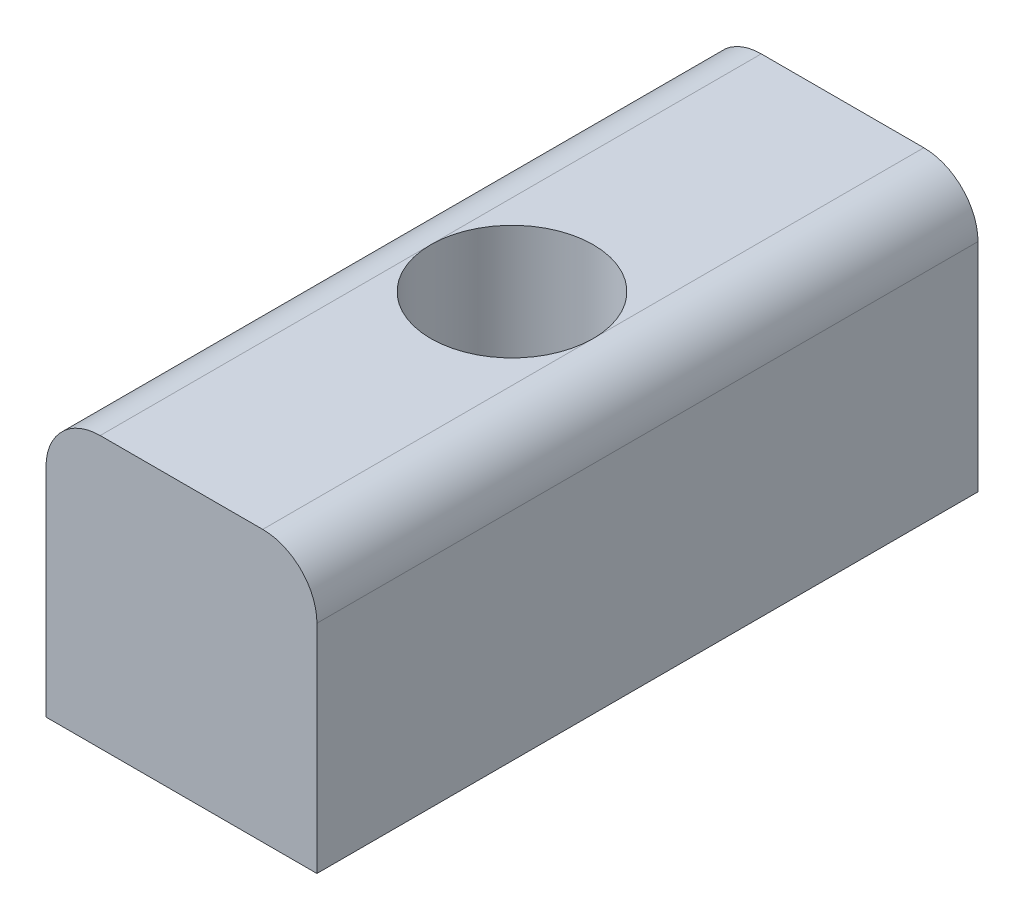
ISO-10303-21;
HEADER;
FILE_DESCRIPTION(('STEP AP214'),'2;1');
FILE_NAME('part.step','',(''),(''),'','','');
FILE_SCHEMA(('AUTOMOTIVE_DESIGN { 1 0 10303 214 1 1 1 1 }'));
ENDSEC;
DATA;
#1=APPLICATION_CONTEXT('core data for automotive mechanical design processes');
#2=APPLICATION_PROTOCOL_DEFINITION('international standard','automotive_design',2000,#1);
#3=PRODUCT_CONTEXT('',#1,'mechanical');
#4=PRODUCT('Part','Part','',(#3));
#5=PRODUCT_RELATED_PRODUCT_CATEGORY('part','',(#4));
#6=PRODUCT_DEFINITION_FORMATION('','',#4);
#7=PRODUCT_DEFINITION_CONTEXT('part definition',#1,'design');
#8=PRODUCT_DEFINITION('design','',#6,#7);
#9=PRODUCT_DEFINITION_SHAPE('','',#8);
#10=(LENGTH_UNIT() NAMED_UNIT(*) SI_UNIT(.MILLI.,.METRE.));
#11=(NAMED_UNIT(*) PLANE_ANGLE_UNIT() SI_UNIT($,.RADIAN.));
#12=(NAMED_UNIT(*) SI_UNIT($,.STERADIAN.) SOLID_ANGLE_UNIT());
#13=UNCERTAINTY_MEASURE_WITH_UNIT(LENGTH_MEASURE(1.E-05),#10,'distance_accuracy_value','');
#14=(GEOMETRIC_REPRESENTATION_CONTEXT(3) GLOBAL_UNCERTAINTY_ASSIGNED_CONTEXT((#13)) GLOBAL_UNIT_ASSIGNED_CONTEXT((#10,
#11,#12)) REPRESENTATION_CONTEXT('',''));
#15=CARTESIAN_POINT('',(0.,0.,0.));
#16=DIRECTION('',(0.,0.,1.));
#17=DIRECTION('',(1.,0.,0.));
#18=AXIS2_PLACEMENT_3D('',#15,#16,#17);
#19=CARTESIAN_POINT('',(0.,10.,0.));
#20=DIRECTION('',(0.,-1.,0.));
#21=DIRECTION('',(0.,0.,-1.));
#22=AXIS2_PLACEMENT_3D('',#19,#20,#21);
#23=PLANE('',#22);
#24=DIRECTION('',(1.,0.,0.));
#25=VECTOR('',#24,1.);
#26=CARTESIAN_POINT('',(-4.99999999999999,10.,12.2));
#27=LINE('',#26,#25);
#28=CARTESIAN_POINT('',(-2.99999999999999,10.,12.2));
#29=VERTEX_POINT('',#28);
#30=CARTESIAN_POINT('',(3.00000000000001,10.,12.2));
#31=VERTEX_POINT('',#30);
#32=EDGE_CURVE('E134',#29,#31,#27,.T.);
#33=ORIENTED_EDGE('',*,*,#32,.T.);
#34=DIRECTION('',(0.,0.,-1.));
#35=VECTOR('',#34,1.);
#36=CARTESIAN_POINT('',(3.00000000000001,10.,0.));
#37=LINE('',#36,#35);
#38=CARTESIAN_POINT('',(3.00000000000001,10.,0.));
#39=VERTEX_POINT('',#38);
#40=EDGE_CURVE('E159',#31,#39,#37,.T.);
#41=ORIENTED_EDGE('',*,*,#40,.T.);
#42=CARTESIAN_POINT('',(0.,10.,0.));
#43=DIRECTION('',(0.,1.,0.));
#44=DIRECTION('',(0.,0.,1.));
#45=AXIS2_PLACEMENT_3D('',#42,#43,#44);
#46=CIRCLE('',#45,3.);
#47=CARTESIAN_POINT('',(-2.99999999999999,10.,0.));
#48=VERTEX_POINT('',#47);
#49=EDGE_CURVE('E131',#48,#39,#46,.T.);
#50=ORIENTED_EDGE('',*,*,#49,.F.);
#51=DIRECTION('',(0.,0.,1.));
#52=VECTOR('',#51,1.);
#53=CARTESIAN_POINT('',(-2.99999999999999,10.,0.));
#54=LINE('',#53,#52);
#55=EDGE_CURVE('E110',#48,#29,#54,.T.);
#56=ORIENTED_EDGE('',*,*,#55,.T.);
#57=EDGE_LOOP('',(#33,#41,#50,#56));
#58=FACE_BOUND('',#57,.T.);
#59=ADVANCED_FACE('F39',(#58),#23,.F.);
#60=EDGE_CURVE('E127',#39,#48,#46,.T.);
#61=ORIENTED_EDGE('',*,*,#60,.F.);
#62=DIRECTION('',(0.,0.,-1.));
#63=VECTOR('',#62,1.);
#64=CARTESIAN_POINT('',(3.00000000000001,10.,0.));
#65=LINE('',#64,#63);
#66=CARTESIAN_POINT('',(3.00000000000001,10.,-12.2));
#67=VERTEX_POINT('',#66);
#68=EDGE_CURVE('E156',#39,#67,#65,.T.);
#69=ORIENTED_EDGE('',*,*,#68,.T.);
#70=DIRECTION('',(-1.,0.,0.));
#71=VECTOR('',#70,1.);
#72=CARTESIAN_POINT('',(-4.99999999999999,10.,-12.2));
#73=LINE('',#72,#71);
#74=CARTESIAN_POINT('',(-2.99999999999999,10.,-12.2));
#75=VERTEX_POINT('',#74);
#76=EDGE_CURVE('E142',#67,#75,#73,.T.);
#77=ORIENTED_EDGE('',*,*,#76,.T.);
#78=DIRECTION('',(0.,0.,1.));
#79=VECTOR('',#78,1.);
#80=CARTESIAN_POINT('',(-2.99999999999999,10.,0.));
#81=LINE('',#80,#79);
#82=EDGE_CURVE('E152',#75,#48,#81,.T.);
#83=ORIENTED_EDGE('',*,*,#82,.T.);
#84=EDGE_LOOP('',(#61,#69,#77,#83));
#85=FACE_BOUND('',#84,.T.);
#86=ADVANCED_FACE('F185',(#85),#23,.F.);
#87=CARTESIAN_POINT('',(0.,0.,0.));
#88=DIRECTION('',(0.,-1.,0.));
#89=DIRECTION('',(0.,0.,-1.));
#90=AXIS2_PLACEMENT_3D('',#87,#88,#89);
#91=PLANE('',#90);
#92=DIRECTION('',(0.,0.,-1.));
#93=VECTOR('',#92,1.);
#94=CARTESIAN_POINT('',(5.00000000000001,0.,12.2));
#95=LINE('',#94,#93);
#96=CARTESIAN_POINT('',(5.00000000000001,0.,12.2));
#97=VERTEX_POINT('',#96);
#98=CARTESIAN_POINT('',(5.00000000000001,0.,-12.2));
#99=VERTEX_POINT('',#98);
#100=EDGE_CURVE('E118',#97,#99,#95,.T.);
#101=ORIENTED_EDGE('',*,*,#100,.F.);
#102=DIRECTION('',(1.,0.,0.));
#103=VECTOR('',#102,1.);
#104=CARTESIAN_POINT('',(-4.99999999999999,0.,12.2));
#105=LINE('',#104,#103);
#106=CARTESIAN_POINT('',(-4.99999999999999,0.,12.2));
#107=VERTEX_POINT('',#106);
#108=EDGE_CURVE('E139',#107,#97,#105,.T.);
#109=ORIENTED_EDGE('',*,*,#108,.F.);
#110=DIRECTION('',(0.,0.,1.));
#111=VECTOR('',#110,1.);
#112=CARTESIAN_POINT('',(-4.99999999999999,0.,12.2));
#113=LINE('',#112,#111);
#114=CARTESIAN_POINT('',(-4.99999999999999,0.,-12.2));
#115=VERTEX_POINT('',#114);
#116=EDGE_CURVE('E120',#115,#107,#113,.T.);
#117=ORIENTED_EDGE('',*,*,#116,.F.);
#118=DIRECTION('',(-1.,0.,0.));
#119=VECTOR('',#118,1.);
#120=CARTESIAN_POINT('',(-4.99999999999999,0.,-12.2));
#121=LINE('',#120,#119);
#122=EDGE_CURVE('E104',#99,#115,#121,.T.);
#123=ORIENTED_EDGE('',*,*,#122,.F.);
#124=EDGE_LOOP('',(#101,#109,#117,#123));
#125=FACE_BOUND('',#124,.T.);
#126=CARTESIAN_POINT('',(0.,0.,0.));
#127=DIRECTION('',(0.,1.,0.));
#128=DIRECTION('',(0.,0.,1.));
#129=AXIS2_PLACEMENT_3D('',#126,#127,#128);
#130=CIRCLE('',#129,3.);
#131=CARTESIAN_POINT('',(0.,0.,2.99999999999997));
#132=VERTEX_POINT('',#131);
#133=EDGE_CURVE('E190',#132,#132,#130,.T.);
#134=ORIENTED_EDGE('',*,*,#133,.T.);
#135=EDGE_LOOP('',(#134));
#136=FACE_BOUND('',#135,.T.);
#137=ADVANCED_FACE('F115',(#125,#136),#91,.T.);
#138=CARTESIAN_POINT('',(5.00000000000001,10.,12.2));
#139=DIRECTION('',(-1.,0.,0.));
#140=DIRECTION('',(0.,0.,1.));
#141=AXIS2_PLACEMENT_3D('',#138,#139,#140);
#142=PLANE('',#141);
#143=DIRECTION('',(0.,-1.,0.));
#144=VECTOR('',#143,1.);
#145=CARTESIAN_POINT('',(5.00000000000001,10.,-12.2));
#146=LINE('',#145,#144);
#147=CARTESIAN_POINT('',(5.00000000000001,8.,-12.2));
#148=VERTEX_POINT('',#147);
#149=EDGE_CURVE('E99',#148,#99,#146,.T.);
#150=ORIENTED_EDGE('',*,*,#149,.F.);
#151=DIRECTION('',(0.,0.,-1.));
#152=VECTOR('',#151,1.);
#153=CARTESIAN_POINT('',(5.00000000000001,8.,12.2));
#154=LINE('',#153,#152);
#155=CARTESIAN_POINT('',(5.00000000000001,8.,12.2));
#156=VERTEX_POINT('',#155);
#157=EDGE_CURVE('E63',#148,#156,#154,.F.);
#158=ORIENTED_EDGE('',*,*,#157,.T.);
#159=DIRECTION('',(0.,-1.,0.));
#160=VECTOR('',#159,1.);
#161=CARTESIAN_POINT('',(5.00000000000001,10.,12.2));
#162=LINE('',#161,#160);
#163=EDGE_CURVE('E124',#156,#97,#162,.T.);
#164=ORIENTED_EDGE('',*,*,#163,.T.);
#165=ORIENTED_EDGE('',*,*,#100,.T.);
#166=EDGE_LOOP('',(#150,#158,#164,#165));
#167=FACE_BOUND('',#166,.T.);
#168=ADVANCED_FACE('F123',(#167),#142,.F.);
#169=CARTESIAN_POINT('',(-4.99999999999999,10.,-12.2));
#170=DIRECTION('',(0.,0.,1.));
#171=DIRECTION('',(1.,0.,0.));
#172=AXIS2_PLACEMENT_3D('',#169,#170,#171);
#173=PLANE('',#172);
#174=ORIENTED_EDGE('',*,*,#76,.F.);
#175=CARTESIAN_POINT('',(3.00000000000001,8.,-12.2));
#176=DIRECTION('',(0.,0.,1.));
#177=DIRECTION('',(1.,0.,0.));
#178=AXIS2_PLACEMENT_3D('',#175,#176,#177);
#179=CIRCLE('',#178,2.);
#180=EDGE_CURVE('E107',#67,#148,#179,.F.);
#181=ORIENTED_EDGE('',*,*,#180,.T.);
#182=ORIENTED_EDGE('',*,*,#149,.T.);
#183=ORIENTED_EDGE('',*,*,#122,.T.);
#184=DIRECTION('',(0.,-1.,0.));
#185=VECTOR('',#184,1.);
#186=CARTESIAN_POINT('',(-4.99999999999999,10.,-12.2));
#187=LINE('',#186,#185);
#188=CARTESIAN_POINT('',(-4.99999999999999,8.,-12.2));
#189=VERTEX_POINT('',#188);
#190=EDGE_CURVE('E111',#189,#115,#187,.T.);
#191=ORIENTED_EDGE('',*,*,#190,.F.);
#192=CARTESIAN_POINT('',(-2.99999999999999,8.,-12.2));
#193=DIRECTION('',(0.,0.,1.));
#194=DIRECTION('',(1.,0.,0.));
#195=AXIS2_PLACEMENT_3D('',#192,#193,#194);
#196=CIRCLE('',#195,2.);
#197=EDGE_CURVE('E163',#189,#75,#196,.F.);
#198=ORIENTED_EDGE('',*,*,#197,.T.);
#199=EDGE_LOOP('',(#174,#181,#182,#183,#191,#198));
#200=FACE_BOUND('',#199,.T.);
#201=ADVANCED_FACE('F102',(#200),#173,.F.);
#202=CARTESIAN_POINT('',(-4.99999999999999,10.,12.2));
#203=DIRECTION('',(1.,0.,0.));
#204=DIRECTION('',(0.,0.,-1.));
#205=AXIS2_PLACEMENT_3D('',#202,#203,#204);
#206=PLANE('',#205);
#207=DIRECTION('',(0.,-1.,0.));
#208=VECTOR('',#207,1.);
#209=CARTESIAN_POINT('',(-4.99999999999999,10.,12.2));
#210=LINE('',#209,#208);
#211=CARTESIAN_POINT('',(-4.99999999999999,8.,12.2));
#212=VERTEX_POINT('',#211);
#213=EDGE_CURVE('E145',#212,#107,#210,.T.);
#214=ORIENTED_EDGE('',*,*,#213,.F.);
#215=DIRECTION('',(0.,0.,1.));
#216=VECTOR('',#215,1.);
#217=CARTESIAN_POINT('',(-4.99999999999999,8.,12.2));
#218=LINE('',#217,#216);
#219=EDGE_CURVE('E11',#212,#189,#218,.F.);
#220=ORIENTED_EDGE('',*,*,#219,.T.);
#221=ORIENTED_EDGE('',*,*,#190,.T.);
#222=ORIENTED_EDGE('',*,*,#116,.T.);
#223=EDGE_LOOP('',(#214,#220,#221,#222));
#224=FACE_BOUND('',#223,.T.);
#225=ADVANCED_FACE('F204',(#224),#206,.F.);
#226=CARTESIAN_POINT('',(-4.99999999999999,10.,12.2));
#227=DIRECTION('',(0.,0.,-1.));
#228=DIRECTION('',(-1.,0.,0.));
#229=AXIS2_PLACEMENT_3D('',#226,#227,#228);
#230=PLANE('',#229);
#231=ORIENTED_EDGE('',*,*,#163,.F.);
#232=CARTESIAN_POINT('',(3.00000000000001,8.,12.2));
#233=DIRECTION('',(0.,0.,-1.));
#234=DIRECTION('',(-1.,0.,0.));
#235=AXIS2_PLACEMENT_3D('',#232,#233,#234);
#236=CIRCLE('',#235,2.);
#237=EDGE_CURVE('E48',#156,#31,#236,.F.);
#238=ORIENTED_EDGE('',*,*,#237,.T.);
#239=ORIENTED_EDGE('',*,*,#32,.F.);
#240=CARTESIAN_POINT('',(-2.99999999999999,8.,12.2));
#241=DIRECTION('',(0.,0.,-1.));
#242=DIRECTION('',(-1.,0.,0.));
#243=AXIS2_PLACEMENT_3D('',#240,#241,#242);
#244=CIRCLE('',#243,2.);
#245=EDGE_CURVE('E55',#29,#212,#244,.F.);
#246=ORIENTED_EDGE('',*,*,#245,.T.);
#247=ORIENTED_EDGE('',*,*,#213,.T.);
#248=ORIENTED_EDGE('',*,*,#108,.T.);
#249=EDGE_LOOP('',(#231,#238,#239,#246,#247,#248));
#250=FACE_BOUND('',#249,.T.);
#251=ADVANCED_FACE('F174',(#250),#230,.F.);
#252=CARTESIAN_POINT('',(0.,10.,0.));
#253=DIRECTION('',(0.,-1.,0.));
#254=DIRECTION('',(0.,0.,-1.));
#255=AXIS2_PLACEMENT_3D('',#252,#253,#254);
#256=CYLINDRICAL_SURFACE('',#255,3.);
#257=ORIENTED_EDGE('',*,*,#60,.T.);
#258=ORIENTED_EDGE('',*,*,#49,.T.);
#259=EDGE_LOOP('',(#257,#258));
#260=FACE_BOUND('',#259,.T.);
#261=ORIENTED_EDGE('',*,*,#133,.F.);
#262=EDGE_LOOP('',(#261));
#263=FACE_BOUND('',#262,.T.);
#264=ADVANCED_FACE('F196',(#260,#263),#256,.F.);
#265=CARTESIAN_POINT('',(3.00000000000001,8.,0.));
#266=DIRECTION('',(0.,0.,-1.));
#267=DIRECTION('',(-1.,0.,0.));
#268=AXIS2_PLACEMENT_3D('',#265,#266,#267);
#269=CYLINDRICAL_SURFACE('',#268,2.);
#270=ORIENTED_EDGE('',*,*,#237,.F.);
#271=ORIENTED_EDGE('',*,*,#157,.F.);
#272=ORIENTED_EDGE('',*,*,#180,.F.);
#273=ORIENTED_EDGE('',*,*,#68,.F.);
#274=ORIENTED_EDGE('',*,*,#40,.F.);
#275=EDGE_LOOP('',(#270,#271,#272,#273,#274));
#276=FACE_BOUND('',#275,.T.);
#277=ADVANCED_FACE('F181',(#276),#269,.T.);
#278=CARTESIAN_POINT('',(-2.99999999999999,8.,0.));
#279=DIRECTION('',(0.,0.,1.));
#280=DIRECTION('',(1.,0.,0.));
#281=AXIS2_PLACEMENT_3D('',#278,#279,#280);
#282=CYLINDRICAL_SURFACE('',#281,2.);
#283=ORIENTED_EDGE('',*,*,#197,.F.);
#284=ORIENTED_EDGE('',*,*,#219,.F.);
#285=ORIENTED_EDGE('',*,*,#245,.F.);
#286=ORIENTED_EDGE('',*,*,#55,.F.);
#287=ORIENTED_EDGE('',*,*,#82,.F.);
#288=EDGE_LOOP('',(#283,#284,#285,#286,#287));
#289=FACE_BOUND('',#288,.T.);
#290=ADVANCED_FACE('F41',(#289),#282,.T.);
#291=CLOSED_SHELL('',(#59,#86,#137,#168,#201,#225,#251,#264,#277,#290));
#292=MANIFOLD_SOLID_BREP('B2',#291);
#293=ADVANCED_BREP_SHAPE_REPRESENTATION('',(#18,#292),#14);
#294=SHAPE_DEFINITION_REPRESENTATION(#9,#293);
ENDSEC;
END-ISO-10303-21;
